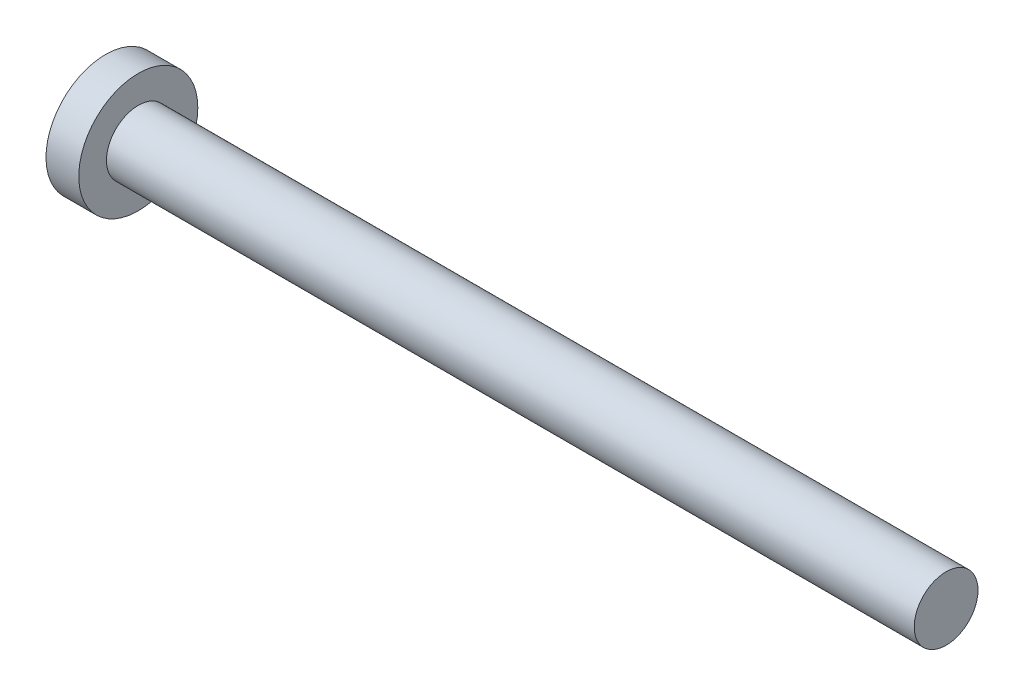
ISO-10303-21;
HEADER;
FILE_DESCRIPTION(('STEP AP214'),'2;1');
FILE_NAME('part.step','',(''),(''),'','','');
FILE_SCHEMA(('AUTOMOTIVE_DESIGN { 1 0 10303 214 1 1 1 1 }'));
ENDSEC;
DATA;
#1=APPLICATION_CONTEXT('core data for automotive mechanical design processes');
#2=APPLICATION_PROTOCOL_DEFINITION('international standard','automotive_design',2000,#1);
#3=PRODUCT_CONTEXT('',#1,'mechanical');
#4=PRODUCT('Part','Part','',(#3));
#5=PRODUCT_RELATED_PRODUCT_CATEGORY('part','',(#4));
#6=PRODUCT_DEFINITION_FORMATION('','',#4);
#7=PRODUCT_DEFINITION_CONTEXT('part definition',#1,'design');
#8=PRODUCT_DEFINITION('design','',#6,#7);
#9=PRODUCT_DEFINITION_SHAPE('','',#8);
#10=(LENGTH_UNIT() NAMED_UNIT(*) SI_UNIT(.MILLI.,.METRE.));
#11=(NAMED_UNIT(*) PLANE_ANGLE_UNIT() SI_UNIT($,.RADIAN.));
#12=(NAMED_UNIT(*) SI_UNIT($,.STERADIAN.) SOLID_ANGLE_UNIT());
#13=UNCERTAINTY_MEASURE_WITH_UNIT(LENGTH_MEASURE(1.E-05),#10,'distance_accuracy_value','');
#14=(GEOMETRIC_REPRESENTATION_CONTEXT(3) GLOBAL_UNCERTAINTY_ASSIGNED_CONTEXT((#13)) GLOBAL_UNIT_ASSIGNED_CONTEXT((#10,
#11,#12)) REPRESENTATION_CONTEXT('',''));
#15=CARTESIAN_POINT('',(0.,0.,0.));
#16=DIRECTION('',(0.,0.,1.));
#17=DIRECTION('',(1.,0.,0.));
#18=AXIS2_PLACEMENT_3D('',#15,#16,#17);
#19=CARTESIAN_POINT('',(5.,0.,0.));
#20=DIRECTION('',(1.,0.,0.));
#21=DIRECTION('',(0.,1.,0.));
#22=AXIS2_PLACEMENT_3D('',#19,#20,#21);
#23=SPHERICAL_SURFACE('',#22,5.);
#24=CARTESIAN_POINT('',(0.857536964558404,0.,0.));
#25=DIRECTION('',(1.,0.,0.));
#26=DIRECTION('',(0.,0.,-1.));
#27=AXIS2_PLACEMENT_3D('',#24,#25,#26);
#28=CIRCLE('',#27,2.8);
#29=CARTESIAN_POINT('',(0.857536964558404,0.,-2.8));
#30=VERTEX_POINT('',#29);
#31=EDGE_CURVE('E229',#30,#30,#28,.T.);
#32=ORIENTED_EDGE('',*,*,#31,.F.);
#33=EDGE_LOOP('',(#32));
#34=FACE_BOUND('',#33,.T.);
#35=CARTESIAN_POINT('',(5.,-0.3,0.));
#36=DIRECTION('',(0.,1.,0.));
#37=DIRECTION('',(0.,0.,1.));
#38=AXIS2_PLACEMENT_3D('',#35,#36,#37);
#39=CIRCLE('',#38,4.99099188538711);
#40=CARTESIAN_POINT('',(0.204192141108152,-0.3,1.3821096123648));
#41=VERTEX_POINT('',#40);
#42=CARTESIAN_POINT('',(0.0452043432650024,-0.3,0.6));
#43=VERTEX_POINT('',#42);
#44=EDGE_CURVE('E163',#41,#43,#39,.F.);
#45=ORIENTED_EDGE('',*,*,#44,.T.);
#46=CARTESIAN_POINT('',(0.0452043432650024,-0.3,0.6));
#47=CARTESIAN_POINT('',(0.0431803765733261,-0.299985307216759,0.58330066442328));
#48=CARTESIAN_POINT('',(0.0413275176268077,-0.301393621844251,0.56658131014707));
#49=CARTESIAN_POINT('',(0.0380100157488105,-0.306971694528783,0.533576799844294));
#50=CARTESIAN_POINT('',(0.0365452230698605,-0.311140385229224,0.517291478520808));
#51=CARTESIAN_POINT('',(0.0340472247062488,-0.322159146630374,0.485603015386071));
#52=CARTESIAN_POINT('',(0.0330143639783948,-0.329011352060552,0.470200587124305));
#53=CARTESIAN_POINT('',(0.0314127307694634,-0.345205676257373,0.440745323067069));
#54=CARTESIAN_POINT('',(0.0308438058607196,-0.354546975884403,0.426692045343612));
#55=CARTESIAN_POINT('',(0.03018953292316,-0.375375503630217,0.400444519821415));
#56=CARTESIAN_POINT('',(0.0301004392402796,-0.386845384782284,0.38823659768892));
#57=CARTESIAN_POINT('',(0.0303984595749412,-0.411653153039893,0.365897305977699));
#58=CARTESIAN_POINT('',(0.0307856444365276,-0.424991317781719,0.355766245583269));
#59=CARTESIAN_POINT('',(0.0320223810339676,-0.453099677373167,0.337899284835798));
#60=CARTESIAN_POINT('',(0.0328703456862312,-0.467864814543113,0.33015530522925));
#61=CARTESIAN_POINT('',(0.0350026994062988,-0.498444042646254,0.317225069756468));
#62=CARTESIAN_POINT('',(0.0362869304045913,-0.514257751989369,0.312037889168157));
#63=CARTESIAN_POINT('',(0.0388210734003054,-0.541786224745504,0.305467740201196));
#64=CARTESIAN_POINT('',(0.0399723661586706,-0.553355690495333,0.303417160437875));
#65=CARTESIAN_POINT('',(0.0424563450668788,-0.576618891467464,0.300683149774227));
#66=CARTESIAN_POINT('',(0.0437887689490354,-0.588312424882147,0.299997764205199));
#67=CARTESIAN_POINT('',(0.0452043432650023,-0.6,0.3));
#68=B_SPLINE_CURVE_WITH_KNOTS('',3,(#46,#47,#48,#49,#50,#51,#52,#53,#54,#55,#56,#57,#58,#59,#60,
#61,#62,#63,#64,#65,#66,#67),.UNSPECIFIED.,.F.,.F.,(4,2,2,2,2,2,2,2,2,2,4),(0.,
0.0504040124836523,0.100788546583663,0.151213243139993,0.201621365810884,0.251635416538133,
0.3016569075042,0.351507189411116,0.401339428623963,0.436680545510309,0.471971024931029),.UNSPECIFIED.);
#69=CARTESIAN_POINT('',(0.0452043432650024,-0.6,0.3));
#70=VERTEX_POINT('',#69);
#71=EDGE_CURVE('E148',#43,#70,#68,.T.);
#72=ORIENTED_EDGE('',*,*,#71,.T.);
#73=CARTESIAN_POINT('',(5.,0.,0.3));
#74=DIRECTION('',(0.,0.,-1.));
#75=DIRECTION('',(0.,1.,0.));
#76=AXIS2_PLACEMENT_3D('',#73,#74,#75);
#77=CIRCLE('',#76,4.99099188538711);
#78=CARTESIAN_POINT('',(0.204192141108152,-1.3821096123648,0.299999999999999));
#79=VERTEX_POINT('',#78);
#80=EDGE_CURVE('E172',#70,#79,#77,.F.);
#81=ORIENTED_EDGE('',*,*,#80,.T.);
#82=CARTESIAN_POINT('',(4.39951905283833,1.0400635094611,0.));
#83=DIRECTION('',(-0.500000000000001,0.866025403784438,0.));
#84=DIRECTION('',(-0.866025403784438,-0.500000000000001,0.));
#85=AXIS2_PLACEMENT_3D('',#82,#83,#84);
#86=CIRCLE('',#85,4.8536265336739);
#87=CARTESIAN_POINT('',(0.204192141108152,-1.3821096123648,-0.3));
#88=VERTEX_POINT('',#87);
#89=EDGE_CURVE('E175',#79,#88,#86,.F.);
#90=ORIENTED_EDGE('',*,*,#89,.T.);
#91=CARTESIAN_POINT('',(5.,0.,-0.3));
#92=DIRECTION('',(0.,0.,1.));
#93=DIRECTION('',(1.,0.,0.));
#94=AXIS2_PLACEMENT_3D('',#91,#92,#93);
#95=CIRCLE('',#94,4.99099188538711);
#96=CARTESIAN_POINT('',(0.0452043432650024,-0.6,-0.3));
#97=VERTEX_POINT('',#96);
#98=EDGE_CURVE('E182',#88,#97,#95,.F.);
#99=ORIENTED_EDGE('',*,*,#98,.T.);
#100=CARTESIAN_POINT('',(0.0452043432650024,-0.6,-0.3));
#101=CARTESIAN_POINT('',(0.0431803765733258,-0.58330066442328,-0.299985307216759));
#102=CARTESIAN_POINT('',(0.0413275176268076,-0.56658131014707,-0.301393621844251));
#103=CARTESIAN_POINT('',(0.0380100157488106,-0.533576799844295,-0.306971694528783));
#104=CARTESIAN_POINT('',(0.0365452230698608,-0.517291478520808,-0.311140385229224));
#105=CARTESIAN_POINT('',(0.0340472247062486,-0.485603015386071,-0.322159146630374));
#106=CARTESIAN_POINT('',(0.0330143639783939,-0.470200587124306,-0.329011352060552));
#107=CARTESIAN_POINT('',(0.0314127307694625,-0.44074532306707,-0.345205676257373));
#108=CARTESIAN_POINT('',(0.0308438058607194,-0.426692045343612,-0.354546975884403));
#109=CARTESIAN_POINT('',(0.0301895329231602,-0.400444519821416,-0.375375503630217));
#110=CARTESIAN_POINT('',(0.0301004392402796,-0.388236597688921,-0.386845384782284));
#111=CARTESIAN_POINT('',(0.0303984595749411,-0.3658973059777,-0.411653153039893));
#112=CARTESIAN_POINT('',(0.0307856444365276,-0.355766245583269,-0.424991317781719));
#113=CARTESIAN_POINT('',(0.0320223810339676,-0.337899284835798,-0.453099677373167));
#114=CARTESIAN_POINT('',(0.0328703456862312,-0.330155305229251,-0.467864814543113));
#115=CARTESIAN_POINT('',(0.0350026994062988,-0.317225069756469,-0.498444042646254));
#116=CARTESIAN_POINT('',(0.0362869304045913,-0.312037889168157,-0.514257751989369));
#117=CARTESIAN_POINT('',(0.0388210734003054,-0.305467740201196,-0.541786224745504));
#118=CARTESIAN_POINT('',(0.0399723661586706,-0.303417160437876,-0.553355690495333));
#119=CARTESIAN_POINT('',(0.0424563450668788,-0.300683149774227,-0.576618891467464));
#120=CARTESIAN_POINT('',(0.0437887689490354,-0.299997764205199,-0.588312424882147));
#121=CARTESIAN_POINT('',(0.0452043432650023,-0.3,-0.6));
#122=B_SPLINE_CURVE_WITH_KNOTS('',3,(#100,#101,#102,#103,#104,#105,#106,#107,#108,#109,#110,
#111,#112,#113,#114,#115,#116,#117,#118,#119,#120,#121),.UNSPECIFIED.,.F.,.F.,(4,2,2,2,2,2,2,2,
2,2,4),(0.,0.0504040124836523,0.100788546583663,0.151213243139993,0.201621365810883,
0.251635416538133,0.3016569075042,0.351507189411116,0.401339428623963,0.436680545510309,
0.471971024931029),.UNSPECIFIED.);
#123=CARTESIAN_POINT('',(0.0452043432650024,-0.3,-0.6));
#124=VERTEX_POINT('',#123);
#125=EDGE_CURVE('E159',#97,#124,#122,.T.);
#126=ORIENTED_EDGE('',*,*,#125,.T.);
#127=CARTESIAN_POINT('',(5.,-0.3,0.));
#128=DIRECTION('',(0.,1.,0.));
#129=DIRECTION('',(0.,0.,1.));
#130=AXIS2_PLACEMENT_3D('',#127,#128,#129);
#131=CIRCLE('',#130,4.99099188538711);
#132=CARTESIAN_POINT('',(0.204192141108152,-0.3,-1.3821096123648));
#133=VERTEX_POINT('',#132);
#134=EDGE_CURVE('E180',#124,#133,#131,.F.);
#135=ORIENTED_EDGE('',*,*,#134,.T.);
#136=CARTESIAN_POINT('',(4.39951905283833,0.,1.0400635094611));
#137=DIRECTION('',(-0.500000000000001,0.,0.866025403784438));
#138=DIRECTION('',(0.866025403784438,0.,0.500000000000001));
#139=AXIS2_PLACEMENT_3D('',#136,#137,#138);
#140=CIRCLE('',#139,4.8536265336739);
#141=CARTESIAN_POINT('',(0.204192141108152,0.3,-1.3821096123648));
#142=VERTEX_POINT('',#141);
#143=EDGE_CURVE('E183',#133,#142,#140,.F.);
#144=ORIENTED_EDGE('',*,*,#143,.T.);
#145=CARTESIAN_POINT('',(5.,0.3,0.));
#146=DIRECTION('',(0.,-1.,0.));
#147=DIRECTION('',(0.,0.,-1.));
#148=AXIS2_PLACEMENT_3D('',#145,#146,#147);
#149=CIRCLE('',#148,4.99099188538711);
#150=CARTESIAN_POINT('',(0.0452043432650024,0.3,-0.6));
#151=VERTEX_POINT('',#150);
#152=EDGE_CURVE('E184',#142,#151,#149,.F.);
#153=ORIENTED_EDGE('',*,*,#152,.T.);
#154=CARTESIAN_POINT('',(0.0452043432650024,0.3,-0.6));
#155=CARTESIAN_POINT('',(0.0431803765733264,0.299985307216759,-0.58330066442328));
#156=CARTESIAN_POINT('',(0.0413275176268081,0.301393621844251,-0.56658131014707));
#157=CARTESIAN_POINT('',(0.0380100157488108,0.306971694528783,-0.533576799844295));
#158=CARTESIAN_POINT('',(0.0365452230698607,0.311140385229223,-0.517291478520809));
#159=CARTESIAN_POINT('',(0.0340472247062487,0.322159146630374,-0.485603015386071));
#160=CARTESIAN_POINT('',(0.0330143639783944,0.329011352060552,-0.470200587124306));
#161=CARTESIAN_POINT('',(0.0314127307694625,0.345205676257373,-0.44074532306707));
#162=CARTESIAN_POINT('',(0.0308438058607185,0.354546975884403,-0.426692045343612));
#163=CARTESIAN_POINT('',(0.0301895329231594,0.375375503630217,-0.400444519821416));
#164=CARTESIAN_POINT('',(0.0301004392402797,0.386845384782284,-0.388236597688921));
#165=CARTESIAN_POINT('',(0.0303984595749418,0.411653153039893,-0.3658973059777));
#166=CARTESIAN_POINT('',(0.030785644436528,0.424991317781719,-0.355766245583269));
#167=CARTESIAN_POINT('',(0.0320223810339672,0.453099677373167,-0.337899284835798));
#168=CARTESIAN_POINT('',(0.0328703456862304,0.467864814543113,-0.330155305229251));
#169=CARTESIAN_POINT('',(0.0350026994062981,0.498444042646254,-0.317225069756469));
#170=CARTESIAN_POINT('',(0.0362869304045911,0.514257751989369,-0.312037889168158));
#171=CARTESIAN_POINT('',(0.0388210734003055,0.541786224745504,-0.305467740201196));
#172=CARTESIAN_POINT('',(0.0399723661586706,0.553355690495333,-0.303417160437876));
#173=CARTESIAN_POINT('',(0.0424563450668787,0.576618891467464,-0.300683149774227));
#174=CARTESIAN_POINT('',(0.0437887689490352,0.588312424882147,-0.299997764205199));
#175=CARTESIAN_POINT('',(0.0452043432650023,0.6,-0.3));
#176=B_SPLINE_CURVE_WITH_KNOTS('',3,(#154,#155,#156,#157,#158,#159,#160,#161,#162,#163,#164,
#165,#166,#167,#168,#169,#170,#171,#172,#173,#174,#175),.UNSPECIFIED.,.F.,.F.,(4,2,2,2,2,2,2,2,
2,2,4),(0.,0.0504040124836523,0.100788546583663,0.151213243139993,0.201621365810884,
0.251635416538133,0.3016569075042,0.351507189411116,0.401339428623963,0.436680545510309,
0.471971024931029),.UNSPECIFIED.);
#177=CARTESIAN_POINT('',(0.0452043432650024,0.6,-0.3));
#178=VERTEX_POINT('',#177);
#179=EDGE_CURVE('E166',#151,#178,#176,.T.);
#180=ORIENTED_EDGE('',*,*,#179,.T.);
#181=CARTESIAN_POINT('',(5.,0.,-0.3));
#182=DIRECTION('',(0.,0.,1.));
#183=DIRECTION('',(1.,0.,0.));
#184=AXIS2_PLACEMENT_3D('',#181,#182,#183);
#185=CIRCLE('',#184,4.99099188538711);
#186=CARTESIAN_POINT('',(0.204192141108152,1.3821096123648,-0.3));
#187=VERTEX_POINT('',#186);
#188=EDGE_CURVE('E187',#178,#187,#185,.F.);
#189=ORIENTED_EDGE('',*,*,#188,.T.);
#190=CARTESIAN_POINT('',(4.39951905283833,-1.0400635094611,0.));
#191=DIRECTION('',(-0.500000000000001,-0.866025403784438,0.));
#192=DIRECTION('',(0.866025403784438,-0.500000000000001,0.));
#193=AXIS2_PLACEMENT_3D('',#190,#191,#192);
#194=CIRCLE('',#193,4.8536265336739);
#195=CARTESIAN_POINT('',(0.204192141108152,1.3821096123648,0.3));
#196=VERTEX_POINT('',#195);
#197=EDGE_CURVE('E213',#187,#196,#194,.F.);
#198=ORIENTED_EDGE('',*,*,#197,.T.);
#199=CARTESIAN_POINT('',(5.,0.,0.3));
#200=DIRECTION('',(0.,0.,-1.));
#201=DIRECTION('',(0.,1.,0.));
#202=AXIS2_PLACEMENT_3D('',#199,#200,#201);
#203=CIRCLE('',#202,4.99099188538711);
#204=CARTESIAN_POINT('',(0.0452043432650024,0.6,0.3));
#205=VERTEX_POINT('',#204);
#206=EDGE_CURVE('E216',#196,#205,#203,.F.);
#207=ORIENTED_EDGE('',*,*,#206,.T.);
#208=CARTESIAN_POINT('',(0.0452043432650024,0.6,0.3));
#209=CARTESIAN_POINT('',(0.0431803765733264,0.58330066442328,0.299985307216759));
#210=CARTESIAN_POINT('',(0.0413275176268081,0.56658131014707,0.30139362184425));
#211=CARTESIAN_POINT('',(0.0380100157488108,0.533576799844294,0.306971694528782));
#212=CARTESIAN_POINT('',(0.0365452230698607,0.517291478520808,0.311140385229223));
#213=CARTESIAN_POINT('',(0.0340472247062487,0.485603015386071,0.322159146630374));
#214=CARTESIAN_POINT('',(0.0330143639783944,0.470200587124306,0.329011352060551));
#215=CARTESIAN_POINT('',(0.0314127307694625,0.44074532306707,0.345205676257373));
#216=CARTESIAN_POINT('',(0.0308438058607185,0.426692045343612,0.354546975884403));
#217=CARTESIAN_POINT('',(0.0301895329231594,0.400444519821416,0.375375503630217));
#218=CARTESIAN_POINT('',(0.0301004392402797,0.38823659768892,0.386845384782283));
#219=CARTESIAN_POINT('',(0.0303984595749418,0.365897305977699,0.411653153039892));
#220=CARTESIAN_POINT('',(0.030785644436528,0.355766245583269,0.424991317781719));
#221=CARTESIAN_POINT('',(0.0320223810339672,0.337899284835798,0.453099677373167));
#222=CARTESIAN_POINT('',(0.0328703456862304,0.33015530522925,0.467864814543113));
#223=CARTESIAN_POINT('',(0.0350026994062981,0.317225069756469,0.498444042646254));
#224=CARTESIAN_POINT('',(0.0362869304045911,0.312037889168157,0.514257751989368));
#225=CARTESIAN_POINT('',(0.0388210734003054,0.305467740201196,0.541786224745503));
#226=CARTESIAN_POINT('',(0.0399723661586706,0.303417160437875,0.553355690495333));
#227=CARTESIAN_POINT('',(0.0424563450668787,0.300683149774227,0.576618891467463));
#228=CARTESIAN_POINT('',(0.0437887689490352,0.299997764205199,0.588312424882147));
#229=CARTESIAN_POINT('',(0.0452043432650023,0.3,0.6));
#230=B_SPLINE_CURVE_WITH_KNOTS('',3,(#208,#209,#210,#211,#212,#213,#214,#215,#216,#217,#218,
#219,#220,#221,#222,#223,#224,#225,#226,#227,#228,#229),.UNSPECIFIED.,.F.,.F.,(4,2,2,2,2,2,2,2,
2,2,4),(0.,0.0504040124836523,0.100788546583663,0.151213243139993,0.201621365810883,
0.251635416538133,0.3016569075042,0.351507189411116,0.401339428623963,0.436680545510309,
0.471971024931029),.UNSPECIFIED.);
#231=CARTESIAN_POINT('',(0.0452043432650024,0.3,0.6));
#232=VERTEX_POINT('',#231);
#233=EDGE_CURVE('E286',#205,#232,#230,.T.);
#234=ORIENTED_EDGE('',*,*,#233,.T.);
#235=CARTESIAN_POINT('',(5.,0.3,0.));
#236=DIRECTION('',(0.,-1.,0.));
#237=DIRECTION('',(0.,0.,-1.));
#238=AXIS2_PLACEMENT_3D('',#235,#236,#237);
#239=CIRCLE('',#238,4.99099188538711);
#240=CARTESIAN_POINT('',(0.204192141108152,0.3,1.3821096123648));
#241=VERTEX_POINT('',#240);
#242=EDGE_CURVE('E167',#232,#241,#239,.F.);
#243=ORIENTED_EDGE('',*,*,#242,.T.);
#244=CARTESIAN_POINT('',(4.39951905283833,0.,-1.0400635094611));
#245=DIRECTION('',(-0.500000000000001,0.,-0.866025403784438));
#246=DIRECTION('',(-0.866025403784438,0.,0.500000000000001));
#247=AXIS2_PLACEMENT_3D('',#244,#245,#246);
#248=CIRCLE('',#247,4.8536265336739);
#249=EDGE_CURVE('E171',#241,#41,#248,.F.);
#250=ORIENTED_EDGE('',*,*,#249,.T.);
#251=EDGE_LOOP('',(#45,#72,#81,#90,#99,#126,#135,#144,#153,#180,#189,#198,#207,#234,#243,#250));
#252=FACE_BOUND('',#251,.T.);
#253=ADVANCED_FACE('F38',(#34,#252),#23,.T.);
#254=CARTESIAN_POINT('',(40.4,1.5,0.));
#255=DIRECTION('',(1.,0.,0.));
#256=DIRECTION('',(0.,0.,-1.));
#257=AXIS2_PLACEMENT_3D('',#254,#255,#256);
#258=PLANE('',#257);
#259=CARTESIAN_POINT('',(40.4,0.,0.));
#260=DIRECTION('',(1.,0.,0.));
#261=DIRECTION('',(0.,0.,-1.));
#262=AXIS2_PLACEMENT_3D('',#259,#260,#261);
#263=CIRCLE('',#262,1.5);
#264=CARTESIAN_POINT('',(40.4,0.,-1.5));
#265=VERTEX_POINT('',#264);
#266=EDGE_CURVE('E268',#265,#265,#263,.T.);
#267=ORIENTED_EDGE('',*,*,#266,.T.);
#268=EDGE_LOOP('',(#267));
#269=FACE_BOUND('',#268,.T.);
#270=ADVANCED_FACE('F324',(#269),#258,.T.);
#271=CARTESIAN_POINT('',(4.51581291088132,0.,0.));
#272=DIRECTION('',(1.,0.,0.));
#273=DIRECTION('',(0.,0.,-1.));
#274=AXIS2_PLACEMENT_3D('',#271,#272,#273);
#275=CYLINDRICAL_SURFACE('',#274,1.5);
#276=CARTESIAN_POINT('',(2.4,0.,0.));
#277=DIRECTION('',(1.,0.,0.));
#278=DIRECTION('',(0.,0.,-1.));
#279=AXIS2_PLACEMENT_3D('',#276,#277,#278);
#280=CIRCLE('',#279,1.5);
#281=CARTESIAN_POINT('',(2.4,0.,-1.5));
#282=VERTEX_POINT('',#281);
#283=EDGE_CURVE('E270',#282,#282,#280,.T.);
#284=ORIENTED_EDGE('',*,*,#283,.T.);
#285=EDGE_LOOP('',(#284));
#286=FACE_BOUND('',#285,.T.);
#287=ORIENTED_EDGE('',*,*,#266,.F.);
#288=EDGE_LOOP('',(#287));
#289=FACE_BOUND('',#288,.T.);
#290=ADVANCED_FACE('F329',(#286,#289),#275,.T.);
#291=CARTESIAN_POINT('',(2.4,1.8,0.));
#292=DIRECTION('',(1.,0.,0.));
#293=DIRECTION('',(0.,0.,-1.));
#294=AXIS2_PLACEMENT_3D('',#291,#292,#293);
#295=PLANE('',#294);
#296=CARTESIAN_POINT('',(2.4,0.,0.));
#297=DIRECTION('',(1.,0.,0.));
#298=DIRECTION('',(0.,0.,-1.));
#299=AXIS2_PLACEMENT_3D('',#296,#297,#298);
#300=CIRCLE('',#299,2.8);
#301=CARTESIAN_POINT('',(2.4,0.,-2.8));
#302=VERTEX_POINT('',#301);
#303=EDGE_CURVE('E275',#302,#302,#300,.T.);
#304=ORIENTED_EDGE('',*,*,#303,.T.);
#305=EDGE_LOOP('',(#304));
#306=FACE_BOUND('',#305,.T.);
#307=ORIENTED_EDGE('',*,*,#283,.F.);
#308=EDGE_LOOP('',(#307));
#309=FACE_BOUND('',#308,.T.);
#310=ADVANCED_FACE('F340',(#306,#309),#295,.T.);
#311=CARTESIAN_POINT('',(4.51581291088132,0.,0.));
#312=DIRECTION('',(1.,0.,0.));
#313=DIRECTION('',(0.,0.,-1.));
#314=AXIS2_PLACEMENT_3D('',#311,#312,#313);
#315=CYLINDRICAL_SURFACE('',#314,2.8);
#316=ORIENTED_EDGE('',*,*,#31,.T.);
#317=EDGE_LOOP('',(#316));
#318=FACE_BOUND('',#317,.T.);
#319=ORIENTED_EDGE('',*,*,#303,.F.);
#320=EDGE_LOOP('',(#319));
#321=FACE_BOUND('',#320,.T.);
#322=ADVANCED_FACE('F320',(#318,#321),#315,.T.);
#323=CARTESIAN_POINT('',(1.68,0.3,0.3));
#324=DIRECTION('',(0.,-1.,0.));
#325=DIRECTION('',(0.,0.,-1.));
#326=AXIS2_PLACEMENT_3D('',#323,#324,#325);
#327=PLANE('',#326);
#328=ORIENTED_EDGE('',*,*,#242,.F.);
#329=DIRECTION('',(-1.,0.,0.));
#330=VECTOR('',#329,1.);
#331=CARTESIAN_POINT('',(1.68,0.3,0.6));
#332=LINE('',#331,#330);
#333=CARTESIAN_POINT('',(1.55884572681199,0.3,0.6));
#334=VERTEX_POINT('',#333);
#335=EDGE_CURVE('E375',#232,#334,#332,.F.);
#336=ORIENTED_EDGE('',*,*,#335,.T.);
#337=DIRECTION('',(-0.866025403784438,0.,0.500000000000001));
#338=VECTOR('',#337,1.);
#339=CARTESIAN_POINT('',(0.,0.3,1.5));
#340=LINE('',#339,#338);
#341=EDGE_CURVE('E227',#334,#241,#340,.T.);
#342=ORIENTED_EDGE('',*,*,#341,.T.);
#343=EDGE_LOOP('',(#328,#336,#342));
#344=FACE_BOUND('',#343,.T.);
#345=ADVANCED_FACE('F313',(#344),#327,.T.);
#346=CARTESIAN_POINT('',(0.,0.,1.5));
#347=DIRECTION('',(-0.500000000000001,0.,-0.866025403784438));
#348=DIRECTION('',(-0.866025403784438,0.,0.500000000000001));
#349=AXIS2_PLACEMENT_3D('',#346,#347,#348);
#350=PLANE('',#349);
#351=ORIENTED_EDGE('',*,*,#341,.F.);
#352=CARTESIAN_POINT('',(1.55884572681199,0.6,0.6));
#353=DIRECTION('',(-0.500000000000001,0.,-0.866025403784438));
#354=DIRECTION('',(-0.866025403784438,0.,0.500000000000001));
#355=AXIS2_PLACEMENT_3D('',#352,#353,#354);
#356=ELLIPSE('',#355,0.599999999999999,0.3);
#357=CARTESIAN_POINT('',(1.68,0.308268592658541,0.530051547761427));
#358=VERTEX_POINT('',#357);
#359=EDGE_CURVE('E234',#334,#358,#356,.F.);
#360=ORIENTED_EDGE('',*,*,#359,.T.);
#361=DIRECTION('',(0.,-1.,0.));
#362=VECTOR('',#361,1.);
#363=CARTESIAN_POINT('',(1.68,0.,0.530051547761426));
#364=LINE('',#363,#362);
#365=CARTESIAN_POINT('',(1.68,-0.308268592658542,0.530051547761426));
#366=VERTEX_POINT('',#365);
#367=EDGE_CURVE('E200',#358,#366,#364,.T.);
#368=ORIENTED_EDGE('',*,*,#367,.T.);
#369=CARTESIAN_POINT('',(1.55884572681199,-0.6,0.6));
#370=DIRECTION('',(-0.500000000000001,0.,-0.866025403784438));
#371=DIRECTION('',(-0.866025403784438,0.,0.500000000000001));
#372=AXIS2_PLACEMENT_3D('',#369,#370,#371);
#373=ELLIPSE('',#372,0.599999999999999,0.3);
#374=CARTESIAN_POINT('',(1.55884572681199,-0.3,0.6));
#375=VERTEX_POINT('',#374);
#376=EDGE_CURVE('E226',#375,#366,#373,.T.);
#377=ORIENTED_EDGE('',*,*,#376,.F.);
#378=DIRECTION('',(-0.866025403784438,0.,0.500000000000001));
#379=VECTOR('',#378,1.);
#380=CARTESIAN_POINT('',(1.77961524227066,-0.3,0.47253866082107));
#381=LINE('',#380,#379);
#382=EDGE_CURVE('E165',#375,#41,#381,.T.);
#383=ORIENTED_EDGE('',*,*,#382,.T.);
#384=ORIENTED_EDGE('',*,*,#249,.F.);
#385=EDGE_LOOP('',(#351,#360,#368,#377,#383,#384));
#386=FACE_BOUND('',#385,.T.);
#387=ADVANCED_FACE('F311',(#386),#350,.T.);
#388=CARTESIAN_POINT('',(1.68,-0.3,0.3));
#389=DIRECTION('',(0.,1.,0.));
#390=DIRECTION('',(0.,0.,1.));
#391=AXIS2_PLACEMENT_3D('',#388,#389,#390);
#392=PLANE('',#391);
#393=ORIENTED_EDGE('',*,*,#382,.F.);
#394=DIRECTION('',(-1.,0.,0.));
#395=VECTOR('',#394,1.);
#396=CARTESIAN_POINT('',(1.68,-0.3,0.6));
#397=LINE('',#396,#395);
#398=EDGE_CURVE('E152',#375,#43,#397,.T.);
#399=ORIENTED_EDGE('',*,*,#398,.T.);
#400=ORIENTED_EDGE('',*,*,#44,.F.);
#401=EDGE_LOOP('',(#393,#399,#400));
#402=FACE_BOUND('',#401,.T.);
#403=ADVANCED_FACE('F162',(#402),#392,.T.);
#404=CARTESIAN_POINT('',(1.68,-0.3,0.3));
#405=DIRECTION('',(0.,0.,-1.));
#406=DIRECTION('',(0.,1.,0.));
#407=AXIS2_PLACEMENT_3D('',#404,#405,#406);
#408=PLANE('',#407);
#409=ORIENTED_EDGE('',*,*,#80,.F.);
#410=DIRECTION('',(-1.,0.,0.));
#411=VECTOR('',#410,1.);
#412=CARTESIAN_POINT('',(1.68,-0.6,0.3));
#413=LINE('',#412,#411);
#414=CARTESIAN_POINT('',(1.55884572681198,-0.6,0.3));
#415=VERTEX_POINT('',#414);
#416=EDGE_CURVE('E155',#70,#415,#413,.F.);
#417=ORIENTED_EDGE('',*,*,#416,.T.);
#418=DIRECTION('',(-0.866025403784438,-0.500000000000001,0.));
#419=VECTOR('',#418,1.);
#420=CARTESIAN_POINT('',(0.,-1.5,0.299999999999999));
#421=LINE('',#420,#419);
#422=EDGE_CURVE('E188',#415,#79,#421,.T.);
#423=ORIENTED_EDGE('',*,*,#422,.T.);
#424=EDGE_LOOP('',(#409,#417,#423));
#425=FACE_BOUND('',#424,.T.);
#426=ADVANCED_FACE('F306',(#425),#408,.T.);
#427=CARTESIAN_POINT('',(0.,-1.5,0.));
#428=DIRECTION('',(-0.500000000000001,0.866025403784438,0.));
#429=DIRECTION('',(-0.866025403784438,-0.500000000000001,0.));
#430=AXIS2_PLACEMENT_3D('',#427,#428,#429);
#431=PLANE('',#430);
#432=ORIENTED_EDGE('',*,*,#422,.F.);
#433=CARTESIAN_POINT('',(1.55884572681199,-0.6,0.6));
#434=DIRECTION('',(-0.500000000000001,0.866025403784438,0.));
#435=DIRECTION('',(-0.866025403784438,-0.500000000000001,0.));
#436=AXIS2_PLACEMENT_3D('',#433,#434,#435);
#437=ELLIPSE('',#436,0.599999999999999,0.3);
#438=CARTESIAN_POINT('',(1.68,-0.530051547761426,0.308268592658541));
#439=VERTEX_POINT('',#438);
#440=EDGE_CURVE('E203',#415,#439,#437,.F.);
#441=ORIENTED_EDGE('',*,*,#440,.T.);
#442=DIRECTION('',(0.,0.,-1.));
#443=VECTOR('',#442,1.);
#444=CARTESIAN_POINT('',(1.68,-0.530051547761426,0.));
#445=LINE('',#444,#443);
#446=CARTESIAN_POINT('',(1.68,-0.530051547761426,-0.308268592658542));
#447=VERTEX_POINT('',#446);
#448=EDGE_CURVE('E197',#439,#447,#445,.T.);
#449=ORIENTED_EDGE('',*,*,#448,.T.);
#450=CARTESIAN_POINT('',(1.55884572681199,-0.6,-0.6));
#451=DIRECTION('',(-0.500000000000001,0.866025403784438,0.));
#452=DIRECTION('',(-0.866025403784438,-0.500000000000001,0.));
#453=AXIS2_PLACEMENT_3D('',#450,#451,#452);
#454=ELLIPSE('',#453,0.599999999999999,0.3);
#455=CARTESIAN_POINT('',(1.55884572681199,-0.6,-0.3));
#456=VERTEX_POINT('',#455);
#457=EDGE_CURVE('E201',#456,#447,#454,.T.);
#458=ORIENTED_EDGE('',*,*,#457,.F.);
#459=DIRECTION('',(-0.866025403784438,-0.500000000000001,0.));
#460=VECTOR('',#459,1.);
#461=CARTESIAN_POINT('',(1.77961524227066,-0.472538660821069,-0.3));
#462=LINE('',#461,#460);
#463=EDGE_CURVE('E191',#456,#88,#462,.T.);
#464=ORIENTED_EDGE('',*,*,#463,.T.);
#465=ORIENTED_EDGE('',*,*,#89,.F.);
#466=EDGE_LOOP('',(#432,#441,#449,#458,#464,#465));
#467=FACE_BOUND('',#466,.T.);
#468=ADVANCED_FACE('F302',(#467),#431,.T.);
#469=CARTESIAN_POINT('',(1.68,-0.3,-0.3));
#470=DIRECTION('',(0.,0.,1.));
#471=DIRECTION('',(1.,0.,0.));
#472=AXIS2_PLACEMENT_3D('',#469,#470,#471);
#473=PLANE('',#472);
#474=ORIENTED_EDGE('',*,*,#463,.F.);
#475=DIRECTION('',(-1.,0.,0.));
#476=VECTOR('',#475,1.);
#477=CARTESIAN_POINT('',(1.68,-0.6,-0.3));
#478=LINE('',#477,#476);
#479=EDGE_CURVE('E366',#456,#97,#478,.T.);
#480=ORIENTED_EDGE('',*,*,#479,.T.);
#481=ORIENTED_EDGE('',*,*,#98,.F.);
#482=EDGE_LOOP('',(#474,#480,#481));
#483=FACE_BOUND('',#482,.T.);
#484=ADVANCED_FACE('F305',(#483),#473,.T.);
#485=CARTESIAN_POINT('',(1.68,-0.3,-0.3));
#486=DIRECTION('',(0.,1.,0.));
#487=DIRECTION('',(0.,0.,1.));
#488=AXIS2_PLACEMENT_3D('',#485,#486,#487);
#489=PLANE('',#488);
#490=ORIENTED_EDGE('',*,*,#134,.F.);
#491=DIRECTION('',(-1.,0.,0.));
#492=VECTOR('',#491,1.);
#493=CARTESIAN_POINT('',(1.68,-0.3,-0.6));
#494=LINE('',#493,#492);
#495=CARTESIAN_POINT('',(1.55884572681199,-0.3,-0.6));
#496=VERTEX_POINT('',#495);
#497=EDGE_CURVE('E369',#124,#496,#494,.F.);
#498=ORIENTED_EDGE('',*,*,#497,.T.);
#499=DIRECTION('',(-0.866025403784438,0.,-0.500000000000001));
#500=VECTOR('',#499,1.);
#501=CARTESIAN_POINT('',(0.,-0.3,-1.5));
#502=LINE('',#501,#500);
#503=EDGE_CURVE('E196',#496,#133,#502,.T.);
#504=ORIENTED_EDGE('',*,*,#503,.T.);
#505=EDGE_LOOP('',(#490,#498,#504));
#506=FACE_BOUND('',#505,.T.);
#507=ADVANCED_FACE('F310',(#506),#489,.T.);
#508=CARTESIAN_POINT('',(0.,0.,-1.5));
#509=DIRECTION('',(-0.500000000000001,0.,0.866025403784438));
#510=DIRECTION('',(0.866025403784438,0.,0.500000000000001));
#511=AXIS2_PLACEMENT_3D('',#508,#509,#510);
#512=PLANE('',#511);
#513=ORIENTED_EDGE('',*,*,#503,.F.);
#514=CARTESIAN_POINT('',(1.55884572681199,-0.6,-0.6));
#515=DIRECTION('',(-0.500000000000001,0.,0.866025403784438));
#516=DIRECTION('',(-0.866025403784438,0.,-0.500000000000001));
#517=AXIS2_PLACEMENT_3D('',#514,#515,#516);
#518=ELLIPSE('',#517,0.599999999999999,0.3);
#519=CARTESIAN_POINT('',(1.68,-0.308268592658541,-0.530051547761427));
#520=VERTEX_POINT('',#519);
#521=EDGE_CURVE('E11',#496,#520,#518,.F.);
#522=ORIENTED_EDGE('',*,*,#521,.T.);
#523=DIRECTION('',(0.,1.,0.));
#524=VECTOR('',#523,1.);
#525=CARTESIAN_POINT('',(1.68,0.,-0.530051547761427));
#526=LINE('',#525,#524);
#527=CARTESIAN_POINT('',(1.68,0.308268592658541,-0.530051547761427));
#528=VERTEX_POINT('',#527);
#529=EDGE_CURVE('E199',#520,#528,#526,.T.);
#530=ORIENTED_EDGE('',*,*,#529,.T.);
#531=CARTESIAN_POINT('',(1.55884572681199,0.6,-0.6));
#532=DIRECTION('',(-0.500000000000001,0.,0.866025403784438));
#533=DIRECTION('',(-0.866025403784438,0.,-0.500000000000001));
#534=AXIS2_PLACEMENT_3D('',#531,#532,#533);
#535=ELLIPSE('',#534,0.599999999999999,0.3);
#536=CARTESIAN_POINT('',(1.55884572681199,0.3,-0.6));
#537=VERTEX_POINT('',#536);
#538=EDGE_CURVE('E47',#537,#528,#535,.T.);
#539=ORIENTED_EDGE('',*,*,#538,.F.);
#540=DIRECTION('',(-0.866025403784438,0.,-0.500000000000001));
#541=VECTOR('',#540,1.);
#542=CARTESIAN_POINT('',(1.77961524227066,0.3,-0.47253866082107));
#543=LINE('',#542,#541);
#544=EDGE_CURVE('E211',#537,#142,#543,.T.);
#545=ORIENTED_EDGE('',*,*,#544,.T.);
#546=ORIENTED_EDGE('',*,*,#143,.F.);
#547=EDGE_LOOP('',(#513,#522,#530,#539,#545,#546));
#548=FACE_BOUND('',#547,.T.);
#549=ADVANCED_FACE('F254',(#548),#512,.T.);
#550=CARTESIAN_POINT('',(1.68,0.3,-0.3));
#551=DIRECTION('',(0.,-1.,0.));
#552=DIRECTION('',(0.,0.,-1.));
#553=AXIS2_PLACEMENT_3D('',#550,#551,#552);
#554=PLANE('',#553);
#555=ORIENTED_EDGE('',*,*,#544,.F.);
#556=DIRECTION('',(-1.,0.,0.));
#557=VECTOR('',#556,1.);
#558=CARTESIAN_POINT('',(1.68,0.3,-0.6));
#559=LINE('',#558,#557);
#560=EDGE_CURVE('E250',#537,#151,#559,.T.);
#561=ORIENTED_EDGE('',*,*,#560,.T.);
#562=ORIENTED_EDGE('',*,*,#152,.F.);
#563=EDGE_LOOP('',(#555,#561,#562));
#564=FACE_BOUND('',#563,.T.);
#565=ADVANCED_FACE('F309',(#564),#554,.T.);
#566=CARTESIAN_POINT('',(1.68,0.3,-0.3));
#567=DIRECTION('',(0.,0.,1.));
#568=DIRECTION('',(1.,0.,0.));
#569=AXIS2_PLACEMENT_3D('',#566,#567,#568);
#570=PLANE('',#569);
#571=ORIENTED_EDGE('',*,*,#188,.F.);
#572=DIRECTION('',(-1.,0.,0.));
#573=VECTOR('',#572,1.);
#574=CARTESIAN_POINT('',(1.68,0.6,-0.3));
#575=LINE('',#574,#573);
#576=CARTESIAN_POINT('',(1.55884572681199,0.6,-0.3));
#577=VERTEX_POINT('',#576);
#578=EDGE_CURVE('E379',#178,#577,#575,.F.);
#579=ORIENTED_EDGE('',*,*,#578,.T.);
#580=DIRECTION('',(-0.866025403784438,0.500000000000001,0.));
#581=VECTOR('',#580,1.);
#582=CARTESIAN_POINT('',(0.,1.5,-0.3));
#583=LINE('',#582,#581);
#584=EDGE_CURVE('E208',#577,#187,#583,.T.);
#585=ORIENTED_EDGE('',*,*,#584,.T.);
#586=EDGE_LOOP('',(#571,#579,#585));
#587=FACE_BOUND('',#586,.T.);
#588=ADVANCED_FACE('F399',(#587),#570,.T.);
#589=CARTESIAN_POINT('',(0.,1.5,0.));
#590=DIRECTION('',(-0.500000000000001,-0.866025403784438,0.));
#591=DIRECTION('',(0.866025403784438,-0.500000000000001,0.));
#592=AXIS2_PLACEMENT_3D('',#589,#590,#591);
#593=PLANE('',#592);
#594=ORIENTED_EDGE('',*,*,#584,.F.);
#595=CARTESIAN_POINT('',(1.55884572681199,0.6,-0.6));
#596=DIRECTION('',(-0.500000000000001,-0.866025403784438,0.));
#597=DIRECTION('',(-0.866025403784438,0.500000000000001,0.));
#598=AXIS2_PLACEMENT_3D('',#595,#596,#597);
#599=ELLIPSE('',#598,0.599999999999999,0.3);
#600=CARTESIAN_POINT('',(1.68,0.530051547761426,-0.308268592658542));
#601=VERTEX_POINT('',#600);
#602=EDGE_CURVE('E223',#577,#601,#599,.F.);
#603=ORIENTED_EDGE('',*,*,#602,.T.);
#604=DIRECTION('',(0.,0.,1.));
#605=VECTOR('',#604,1.);
#606=CARTESIAN_POINT('',(1.68,0.530051547761426,0.));
#607=LINE('',#606,#605);
#608=CARTESIAN_POINT('',(1.68,0.530051547761426,0.308268592658541));
#609=VERTEX_POINT('',#608);
#610=EDGE_CURVE('E219',#601,#609,#607,.T.);
#611=ORIENTED_EDGE('',*,*,#610,.T.);
#612=CARTESIAN_POINT('',(1.55884572681199,0.6,0.6));
#613=DIRECTION('',(-0.500000000000001,-0.866025403784438,0.));
#614=DIRECTION('',(-0.866025403784438,0.500000000000001,0.));
#615=AXIS2_PLACEMENT_3D('',#612,#613,#614);
#616=ELLIPSE('',#615,0.599999999999999,0.3);
#617=CARTESIAN_POINT('',(1.55884572681199,0.6,0.3));
#618=VERTEX_POINT('',#617);
#619=EDGE_CURVE('E207',#618,#609,#616,.T.);
#620=ORIENTED_EDGE('',*,*,#619,.F.);
#621=DIRECTION('',(-0.866025403784438,0.500000000000001,0.));
#622=VECTOR('',#621,1.);
#623=CARTESIAN_POINT('',(1.77961524227066,0.472538660821069,0.3));
#624=LINE('',#623,#622);
#625=EDGE_CURVE('E212',#618,#196,#624,.T.);
#626=ORIENTED_EDGE('',*,*,#625,.T.);
#627=ORIENTED_EDGE('',*,*,#197,.F.);
#628=EDGE_LOOP('',(#594,#603,#611,#620,#626,#627));
#629=FACE_BOUND('',#628,.T.);
#630=ADVANCED_FACE('F40',(#629),#593,.T.);
#631=CARTESIAN_POINT('',(1.68,0.3,0.3));
#632=DIRECTION('',(0.,0.,-1.));
#633=DIRECTION('',(0.,1.,0.));
#634=AXIS2_PLACEMENT_3D('',#631,#632,#633);
#635=PLANE('',#634);
#636=ORIENTED_EDGE('',*,*,#625,.F.);
#637=DIRECTION('',(-1.,0.,0.));
#638=VECTOR('',#637,1.);
#639=CARTESIAN_POINT('',(1.68,0.6,0.3));
#640=LINE('',#639,#638);
#641=EDGE_CURVE('E372',#618,#205,#640,.T.);
#642=ORIENTED_EDGE('',*,*,#641,.T.);
#643=ORIENTED_EDGE('',*,*,#206,.F.);
#644=EDGE_LOOP('',(#636,#642,#643));
#645=FACE_BOUND('',#644,.T.);
#646=ADVANCED_FACE('F423',(#645),#635,.T.);
#647=CARTESIAN_POINT('',(1.68,0.3,0.3));
#648=DIRECTION('',(1.,0.,0.));
#649=DIRECTION('',(0.,0.,-1.));
#650=AXIS2_PLACEMENT_3D('',#647,#648,#649);
#651=PLANE('',#650);
#652=ORIENTED_EDGE('',*,*,#367,.F.);
#653=CARTESIAN_POINT('',(1.68,0.6,0.6));
#654=DIRECTION('',(1.,0.,0.));
#655=DIRECTION('',(0.,0.,-1.));
#656=AXIS2_PLACEMENT_3D('',#653,#654,#655);
#657=CIRCLE('',#656,0.3);
#658=EDGE_CURVE('E260',#358,#609,#657,.T.);
#659=ORIENTED_EDGE('',*,*,#658,.T.);
#660=ORIENTED_EDGE('',*,*,#610,.F.);
#661=CARTESIAN_POINT('',(1.68,0.6,-0.6));
#662=DIRECTION('',(1.,0.,0.));
#663=DIRECTION('',(0.,0.,-1.));
#664=AXIS2_PLACEMENT_3D('',#661,#662,#663);
#665=CIRCLE('',#664,0.3);
#666=EDGE_CURVE('E204',#601,#528,#665,.T.);
#667=ORIENTED_EDGE('',*,*,#666,.T.);
#668=ORIENTED_EDGE('',*,*,#529,.F.);
#669=CARTESIAN_POINT('',(1.68,-0.6,-0.6));
#670=DIRECTION('',(1.,0.,0.));
#671=DIRECTION('',(0.,0.,-1.));
#672=AXIS2_PLACEMENT_3D('',#669,#670,#671);
#673=CIRCLE('',#672,0.3);
#674=EDGE_CURVE('E55',#520,#447,#673,.T.);
#675=ORIENTED_EDGE('',*,*,#674,.T.);
#676=ORIENTED_EDGE('',*,*,#448,.F.);
#677=CARTESIAN_POINT('',(1.68,-0.6,0.6));
#678=DIRECTION('',(1.,0.,0.));
#679=DIRECTION('',(0.,0.,-1.));
#680=AXIS2_PLACEMENT_3D('',#677,#678,#679);
#681=CIRCLE('',#680,0.3);
#682=EDGE_CURVE('E382',#439,#366,#681,.T.);
#683=ORIENTED_EDGE('',*,*,#682,.T.);
#684=EDGE_LOOP('',(#652,#659,#660,#667,#668,#675,#676,#683));
#685=FACE_BOUND('',#684,.T.);
#686=ADVANCED_FACE('F258',(#685),#651,.F.);
#687=CARTESIAN_POINT('',(1.68,-0.6,0.6));
#688=DIRECTION('',(-1.,0.,0.));
#689=DIRECTION('',(0.,0.,1.));
#690=AXIS2_PLACEMENT_3D('',#687,#688,#689);
#691=CYLINDRICAL_SURFACE('',#690,0.3);
#692=ORIENTED_EDGE('',*,*,#682,.F.);
#693=ORIENTED_EDGE('',*,*,#440,.F.);
#694=ORIENTED_EDGE('',*,*,#416,.F.);
#695=ORIENTED_EDGE('',*,*,#71,.F.);
#696=ORIENTED_EDGE('',*,*,#398,.F.);
#697=ORIENTED_EDGE('',*,*,#376,.T.);
#698=EDGE_LOOP('',(#692,#693,#694,#695,#696,#697));
#699=FACE_BOUND('',#698,.T.);
#700=ADVANCED_FACE('F150',(#699),#691,.T.);
#701=CARTESIAN_POINT('',(1.68,-0.6,-0.6));
#702=DIRECTION('',(-1.,0.,0.));
#703=DIRECTION('',(0.,0.,1.));
#704=AXIS2_PLACEMENT_3D('',#701,#702,#703);
#705=CYLINDRICAL_SURFACE('',#704,0.3);
#706=ORIENTED_EDGE('',*,*,#674,.F.);
#707=ORIENTED_EDGE('',*,*,#521,.F.);
#708=ORIENTED_EDGE('',*,*,#497,.F.);
#709=ORIENTED_EDGE('',*,*,#125,.F.);
#710=ORIENTED_EDGE('',*,*,#479,.F.);
#711=ORIENTED_EDGE('',*,*,#457,.T.);
#712=EDGE_LOOP('',(#706,#707,#708,#709,#710,#711));
#713=FACE_BOUND('',#712,.T.);
#714=ADVANCED_FACE('F354',(#713),#705,.T.);
#715=CARTESIAN_POINT('',(1.68,0.6,0.6));
#716=DIRECTION('',(-1.,0.,0.));
#717=DIRECTION('',(0.,0.,1.));
#718=AXIS2_PLACEMENT_3D('',#715,#716,#717);
#719=CYLINDRICAL_SURFACE('',#718,0.3);
#720=ORIENTED_EDGE('',*,*,#658,.F.);
#721=ORIENTED_EDGE('',*,*,#359,.F.);
#722=ORIENTED_EDGE('',*,*,#335,.F.);
#723=ORIENTED_EDGE('',*,*,#233,.F.);
#724=ORIENTED_EDGE('',*,*,#641,.F.);
#725=ORIENTED_EDGE('',*,*,#619,.T.);
#726=EDGE_LOOP('',(#720,#721,#722,#723,#724,#725));
#727=FACE_BOUND('',#726,.T.);
#728=ADVANCED_FACE('F299',(#727),#719,.T.);
#729=CARTESIAN_POINT('',(1.68,0.6,-0.6));
#730=DIRECTION('',(-1.,0.,0.));
#731=DIRECTION('',(0.,0.,1.));
#732=AXIS2_PLACEMENT_3D('',#729,#730,#731);
#733=CYLINDRICAL_SURFACE('',#732,0.3);
#734=ORIENTED_EDGE('',*,*,#666,.F.);
#735=ORIENTED_EDGE('',*,*,#602,.F.);
#736=ORIENTED_EDGE('',*,*,#578,.F.);
#737=ORIENTED_EDGE('',*,*,#179,.F.);
#738=ORIENTED_EDGE('',*,*,#560,.F.);
#739=ORIENTED_EDGE('',*,*,#538,.T.);
#740=EDGE_LOOP('',(#734,#735,#736,#737,#738,#739));
#741=FACE_BOUND('',#740,.T.);
#742=ADVANCED_FACE('F246',(#741),#733,.T.);
#743=CLOSED_SHELL('',(#253,#270,#290,#310,#322,#345,#387,#403,#426,#468,#484,#507,#549,#565,
#588,#630,#646,#686,#700,#714,#728,#742));
#744=MANIFOLD_SOLID_BREP('B2',#743);
#745=ADVANCED_BREP_SHAPE_REPRESENTATION('',(#18,#744),#14);
#746=SHAPE_DEFINITION_REPRESENTATION(#9,#745);
ENDSEC;
END-ISO-10303-21;
